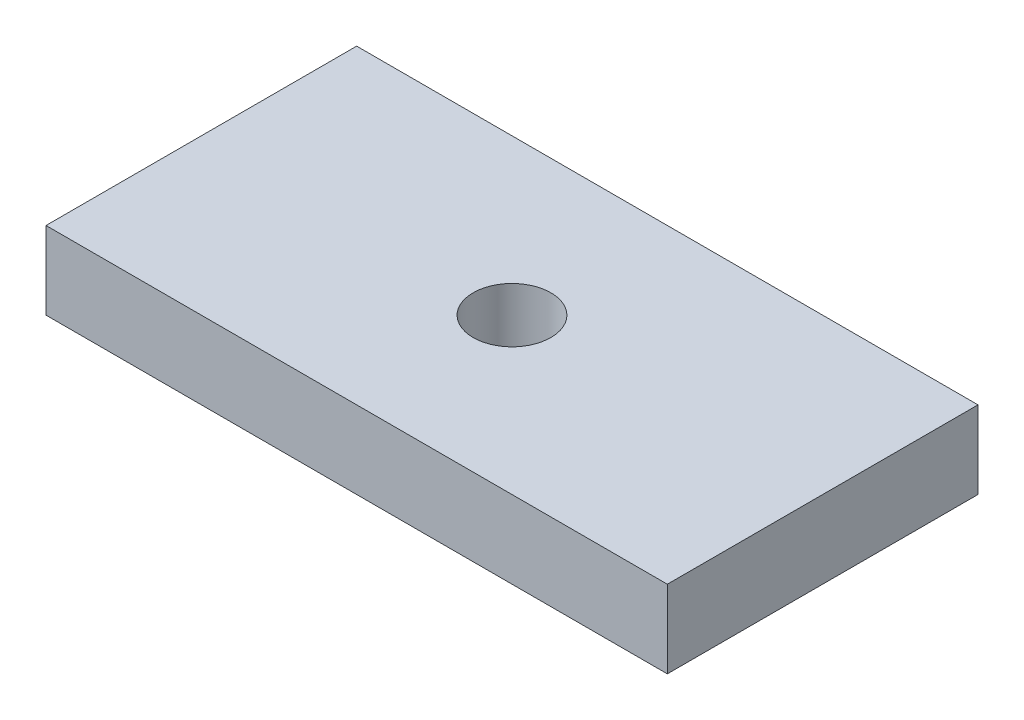
ISO-10303-21;
HEADER;
FILE_DESCRIPTION(('STEP AP214'),'2;1');
FILE_NAME('part.step','',(''),(''),'','','');
FILE_SCHEMA(('AUTOMOTIVE_DESIGN { 1 0 10303 214 1 1 1 1 }'));
ENDSEC;
DATA;
#1=APPLICATION_CONTEXT('core data for automotive mechanical design processes');
#2=APPLICATION_PROTOCOL_DEFINITION('international standard','automotive_design',2000,#1);
#3=PRODUCT_CONTEXT('',#1,'mechanical');
#4=PRODUCT('Part','Part','',(#3));
#5=PRODUCT_RELATED_PRODUCT_CATEGORY('part','',(#4));
#6=PRODUCT_DEFINITION_FORMATION('','',#4);
#7=PRODUCT_DEFINITION_CONTEXT('part definition',#1,'design');
#8=PRODUCT_DEFINITION('design','',#6,#7);
#9=PRODUCT_DEFINITION_SHAPE('','',#8);
#10=(LENGTH_UNIT() NAMED_UNIT(*) SI_UNIT(.MILLI.,.METRE.));
#11=(NAMED_UNIT(*) PLANE_ANGLE_UNIT() SI_UNIT($,.RADIAN.));
#12=(NAMED_UNIT(*) SI_UNIT($,.STERADIAN.) SOLID_ANGLE_UNIT());
#13=UNCERTAINTY_MEASURE_WITH_UNIT(LENGTH_MEASURE(1.E-05),#10,'distance_accuracy_value','');
#14=(GEOMETRIC_REPRESENTATION_CONTEXT(3) GLOBAL_UNCERTAINTY_ASSIGNED_CONTEXT((#13)) GLOBAL_UNIT_ASSIGNED_CONTEXT((#10,
#11,#12)) REPRESENTATION_CONTEXT('',''));
#15=CARTESIAN_POINT('',(0.,0.,0.));
#16=DIRECTION('',(0.,0.,1.));
#17=DIRECTION('',(1.,0.,0.));
#18=AXIS2_PLACEMENT_3D('',#15,#16,#17);
#19=CARTESIAN_POINT('',(0.,3.175,0.));
#20=DIRECTION('',(1.,0.,0.));
#21=DIRECTION('',(0.,0.,-1.));
#22=AXIS2_PLACEMENT_3D('',#19,#20,#21);
#23=PLANE('',#22);
#24=DIRECTION('',(0.,0.,1.));
#25=VECTOR('',#24,1.);
#26=CARTESIAN_POINT('',(0.,0.,0.));
#27=LINE('',#26,#25);
#28=CARTESIAN_POINT('',(0.,0.,-12.7));
#29=VERTEX_POINT('',#28);
#30=CARTESIAN_POINT('',(0.,0.,0.));
#31=VERTEX_POINT('',#30);
#32=EDGE_CURVE('E100',#29,#31,#27,.T.);
#33=ORIENTED_EDGE('',*,*,#32,.T.);
#34=DIRECTION('',(0.,-1.,0.));
#35=VECTOR('',#34,1.);
#36=CARTESIAN_POINT('',(0.,3.175,0.));
#37=LINE('',#36,#35);
#38=CARTESIAN_POINT('',(0.,3.175,0.));
#39=VERTEX_POINT('',#38);
#40=EDGE_CURVE('E11',#39,#31,#37,.T.);
#41=ORIENTED_EDGE('',*,*,#40,.F.);
#42=DIRECTION('',(0.,0.,1.));
#43=VECTOR('',#42,1.);
#44=CARTESIAN_POINT('',(0.,3.175,0.));
#45=LINE('',#44,#43);
#46=CARTESIAN_POINT('',(0.,3.175,-12.7));
#47=VERTEX_POINT('',#46);
#48=EDGE_CURVE('E88',#47,#39,#45,.T.);
#49=ORIENTED_EDGE('',*,*,#48,.F.);
#50=DIRECTION('',(0.,-1.,0.));
#51=VECTOR('',#50,1.);
#52=CARTESIAN_POINT('',(0.,3.175,-12.7));
#53=LINE('',#52,#51);
#54=EDGE_CURVE('E96',#47,#29,#53,.T.);
#55=ORIENTED_EDGE('',*,*,#54,.T.);
#56=EDGE_LOOP('',(#33,#41,#49,#55));
#57=FACE_BOUND('',#56,.T.);
#58=ADVANCED_FACE('F37',(#57),#23,.F.);
#59=CARTESIAN_POINT('',(0.,3.175,0.));
#60=DIRECTION('',(0.,0.,-1.));
#61=DIRECTION('',(-1.,0.,0.));
#62=AXIS2_PLACEMENT_3D('',#59,#60,#61);
#63=PLANE('',#62);
#64=DIRECTION('',(1.,0.,0.));
#65=VECTOR('',#64,1.);
#66=CARTESIAN_POINT('',(0.,0.,0.));
#67=LINE('',#66,#65);
#68=CARTESIAN_POINT('',(25.4,0.,0.));
#69=VERTEX_POINT('',#68);
#70=EDGE_CURVE('E92',#31,#69,#67,.T.);
#71=ORIENTED_EDGE('',*,*,#70,.T.);
#72=DIRECTION('',(0.,-1.,0.));
#73=VECTOR('',#72,1.);
#74=CARTESIAN_POINT('',(25.4,3.175,0.));
#75=LINE('',#74,#73);
#76=CARTESIAN_POINT('',(25.4,3.175,0.));
#77=VERTEX_POINT('',#76);
#78=EDGE_CURVE('E45',#77,#69,#75,.T.);
#79=ORIENTED_EDGE('',*,*,#78,.F.);
#80=DIRECTION('',(1.,0.,0.));
#81=VECTOR('',#80,1.);
#82=CARTESIAN_POINT('',(0.,3.175,0.));
#83=LINE('',#82,#81);
#84=EDGE_CURVE('E83',#39,#77,#83,.T.);
#85=ORIENTED_EDGE('',*,*,#84,.F.);
#86=ORIENTED_EDGE('',*,*,#40,.T.);
#87=EDGE_LOOP('',(#71,#79,#85,#86));
#88=FACE_BOUND('',#87,.T.);
#89=ADVANCED_FACE('F91',(#88),#63,.F.);
#90=CARTESIAN_POINT('',(25.4,3.175,0.));
#91=DIRECTION('',(-1.,0.,0.));
#92=DIRECTION('',(0.,0.,1.));
#93=AXIS2_PLACEMENT_3D('',#90,#91,#92);
#94=PLANE('',#93);
#95=DIRECTION('',(0.,0.,-1.));
#96=VECTOR('',#95,1.);
#97=CARTESIAN_POINT('',(25.4,0.,0.));
#98=LINE('',#97,#96);
#99=CARTESIAN_POINT('',(25.4,0.,-12.7));
#100=VERTEX_POINT('',#99);
#101=EDGE_CURVE('E70',#69,#100,#98,.T.);
#102=ORIENTED_EDGE('',*,*,#101,.T.);
#103=DIRECTION('',(0.,-1.,0.));
#104=VECTOR('',#103,1.);
#105=CARTESIAN_POINT('',(25.4,3.175,-12.7));
#106=LINE('',#105,#104);
#107=CARTESIAN_POINT('',(25.4,3.175,-12.7));
#108=VERTEX_POINT('',#107);
#109=EDGE_CURVE('E93',#108,#100,#106,.T.);
#110=ORIENTED_EDGE('',*,*,#109,.F.);
#111=DIRECTION('',(0.,0.,-1.));
#112=VECTOR('',#111,1.);
#113=CARTESIAN_POINT('',(25.4,3.175,0.));
#114=LINE('',#113,#112);
#115=EDGE_CURVE('E86',#77,#108,#114,.T.);
#116=ORIENTED_EDGE('',*,*,#115,.F.);
#117=ORIENTED_EDGE('',*,*,#78,.T.);
#118=EDGE_LOOP('',(#102,#110,#116,#117));
#119=FACE_BOUND('',#118,.T.);
#120=ADVANCED_FACE('F94',(#119),#94,.F.);
#121=CARTESIAN_POINT('',(0.,3.175,-12.7));
#122=DIRECTION('',(0.,0.,1.));
#123=DIRECTION('',(1.,0.,0.));
#124=AXIS2_PLACEMENT_3D('',#121,#122,#123);
#125=PLANE('',#124);
#126=DIRECTION('',(-1.,0.,0.));
#127=VECTOR('',#126,1.);
#128=CARTESIAN_POINT('',(0.,0.,-12.7));
#129=LINE('',#128,#127);
#130=EDGE_CURVE('E76',#100,#29,#129,.T.);
#131=ORIENTED_EDGE('',*,*,#130,.T.);
#132=ORIENTED_EDGE('',*,*,#54,.F.);
#133=DIRECTION('',(-1.,0.,0.));
#134=VECTOR('',#133,1.);
#135=CARTESIAN_POINT('',(0.,3.175,-12.7));
#136=LINE('',#135,#134);
#137=EDGE_CURVE('E53',#108,#47,#136,.T.);
#138=ORIENTED_EDGE('',*,*,#137,.F.);
#139=ORIENTED_EDGE('',*,*,#109,.T.);
#140=EDGE_LOOP('',(#131,#132,#138,#139));
#141=FACE_BOUND('',#140,.T.);
#142=ADVANCED_FACE('F108',(#141),#125,.F.);
#143=CARTESIAN_POINT('',(0.,3.175,0.));
#144=DIRECTION('',(0.,-1.,0.));
#145=DIRECTION('',(0.,0.,-1.));
#146=AXIS2_PLACEMENT_3D('',#143,#144,#145);
#147=PLANE('',#146);
#148=CARTESIAN_POINT('',(12.7,3.175,-6.35));
#149=DIRECTION('',(0.,1.,0.));
#150=DIRECTION('',(0.,0.,1.));
#151=AXIS2_PLACEMENT_3D('',#148,#149,#150);
#152=CIRCLE('',#151,1.5875);
#153=CARTESIAN_POINT('',(12.7,3.175,-4.7625));
#154=VERTEX_POINT('',#153);
#155=EDGE_CURVE('E114',#154,#154,#152,.T.);
#156=ORIENTED_EDGE('',*,*,#155,.F.);
#157=EDGE_LOOP('',(#156));
#158=FACE_BOUND('',#157,.T.);
#159=ORIENTED_EDGE('',*,*,#48,.T.);
#160=ORIENTED_EDGE('',*,*,#84,.T.);
#161=ORIENTED_EDGE('',*,*,#115,.T.);
#162=ORIENTED_EDGE('',*,*,#137,.T.);
#163=EDGE_LOOP('',(#159,#160,#161,#162));
#164=FACE_BOUND('',#163,.T.);
#165=ADVANCED_FACE('F84',(#158,#164),#147,.F.);
#166=CARTESIAN_POINT('',(0.,0.,0.));
#167=DIRECTION('',(0.,-1.,0.));
#168=DIRECTION('',(0.,0.,-1.));
#169=AXIS2_PLACEMENT_3D('',#166,#167,#168);
#170=PLANE('',#169);
#171=CARTESIAN_POINT('',(12.7,0.,-6.35));
#172=DIRECTION('',(0.,1.,0.));
#173=DIRECTION('',(0.,0.,1.));
#174=AXIS2_PLACEMENT_3D('',#171,#172,#173);
#175=CIRCLE('',#174,1.5875);
#176=CARTESIAN_POINT('',(12.7,0.,-4.7625));
#177=VERTEX_POINT('',#176);
#178=EDGE_CURVE('E103',#177,#177,#175,.T.);
#179=ORIENTED_EDGE('',*,*,#178,.T.);
#180=EDGE_LOOP('',(#179));
#181=FACE_BOUND('',#180,.T.);
#182=ORIENTED_EDGE('',*,*,#32,.F.);
#183=ORIENTED_EDGE('',*,*,#130,.F.);
#184=ORIENTED_EDGE('',*,*,#101,.F.);
#185=ORIENTED_EDGE('',*,*,#70,.F.);
#186=EDGE_LOOP('',(#182,#183,#184,#185));
#187=FACE_BOUND('',#186,.T.);
#188=ADVANCED_FACE('F111',(#181,#187),#170,.T.);
#189=CARTESIAN_POINT('',(12.7,0.,-6.35));
#190=DIRECTION('',(0.,1.,0.));
#191=DIRECTION('',(0.,0.,1.));
#192=AXIS2_PLACEMENT_3D('',#189,#190,#191);
#193=CYLINDRICAL_SURFACE('',#192,1.5875);
#194=ORIENTED_EDGE('',*,*,#178,.F.);
#195=EDGE_LOOP('',(#194));
#196=FACE_BOUND('',#195,.T.);
#197=ORIENTED_EDGE('',*,*,#155,.T.);
#198=EDGE_LOOP('',(#197));
#199=FACE_BOUND('',#198,.T.);
#200=ADVANCED_FACE('F121',(#196,#199),#193,.F.);
#201=CLOSED_SHELL('',(#58,#89,#120,#142,#165,#188,#200));
#202=MANIFOLD_SOLID_BREP('B2',#201);
#203=ADVANCED_BREP_SHAPE_REPRESENTATION('',(#18,#202),#14);
#204=SHAPE_DEFINITION_REPRESENTATION(#9,#203);
ENDSEC;
END-ISO-10303-21;
